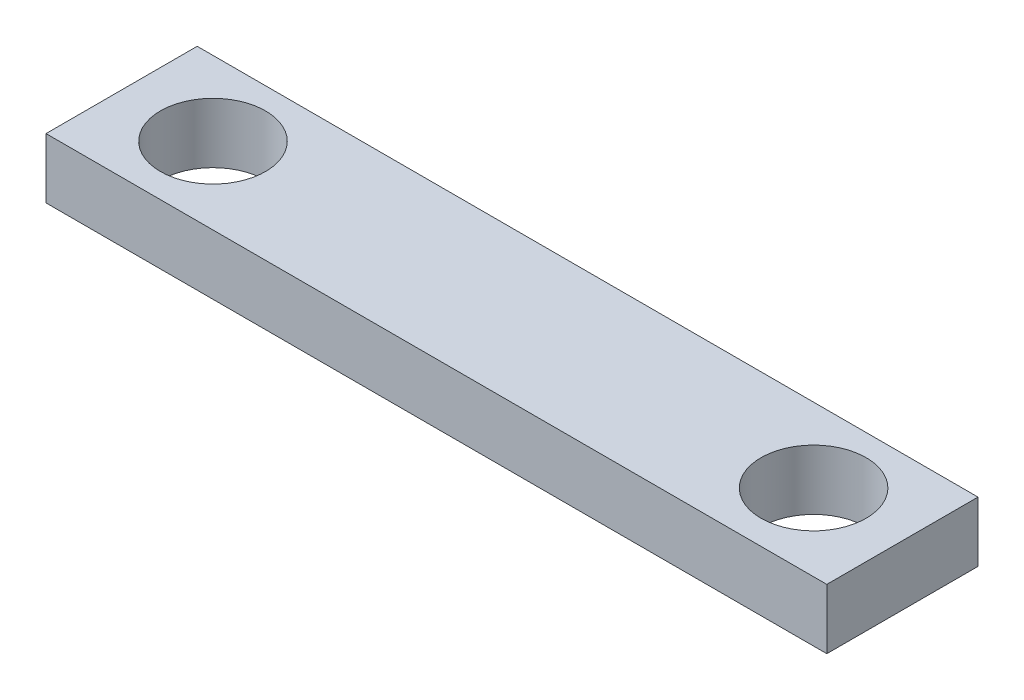
ISO-10303-21;
HEADER;
FILE_DESCRIPTION(('STEP AP214'),'2;1');
FILE_NAME('part.step','',(''),(''),'','','');
FILE_SCHEMA(('AUTOMOTIVE_DESIGN { 1 0 10303 214 1 1 1 1 }'));
ENDSEC;
DATA;
#1=APPLICATION_CONTEXT('core data for automotive mechanical design processes');
#2=APPLICATION_PROTOCOL_DEFINITION('international standard','automotive_design',2000,#1);
#3=PRODUCT_CONTEXT('',#1,'mechanical');
#4=PRODUCT('Part','Part','',(#3));
#5=PRODUCT_RELATED_PRODUCT_CATEGORY('part','',(#4));
#6=PRODUCT_DEFINITION_FORMATION('','',#4);
#7=PRODUCT_DEFINITION_CONTEXT('part definition',#1,'design');
#8=PRODUCT_DEFINITION('design','',#6,#7);
#9=PRODUCT_DEFINITION_SHAPE('','',#8);
#10=(LENGTH_UNIT() NAMED_UNIT(*) SI_UNIT(.MILLI.,.METRE.));
#11=(NAMED_UNIT(*) PLANE_ANGLE_UNIT() SI_UNIT($,.RADIAN.));
#12=(NAMED_UNIT(*) SI_UNIT($,.STERADIAN.) SOLID_ANGLE_UNIT());
#13=UNCERTAINTY_MEASURE_WITH_UNIT(LENGTH_MEASURE(1.E-05),#10,'distance_accuracy_value','');
#14=(GEOMETRIC_REPRESENTATION_CONTEXT(3) GLOBAL_UNCERTAINTY_ASSIGNED_CONTEXT((#13)) GLOBAL_UNIT_ASSIGNED_CONTEXT((#10,
#11,#12)) REPRESENTATION_CONTEXT('',''));
#15=CARTESIAN_POINT('',(0.,0.,0.));
#16=DIRECTION('',(0.,0.,1.));
#17=DIRECTION('',(1.,0.,0.));
#18=AXIS2_PLACEMENT_3D('',#15,#16,#17);
#19=CARTESIAN_POINT('',(0.,2.,0.));
#20=DIRECTION('',(0.,1.,0.));
#21=DIRECTION('',(0.,0.,1.));
#22=AXIS2_PLACEMENT_3D('',#19,#20,#21);
#23=PLANE('',#22);
#24=CARTESIAN_POINT('',(-5.61881850166234,2.,-0.384006764925553));
#25=DIRECTION('',(0.,1.,0.));
#26=DIRECTION('',(0.,0.,1.));
#27=AXIS2_PLACEMENT_3D('',#24,#25,#26);
#28=CIRCLE('',#27,1.75);
#29=CARTESIAN_POINT('',(-5.61881850166234,2.,1.36599323507445));
#30=VERTEX_POINT('',#29);
#31=EDGE_CURVE('E106',#30,#30,#28,.T.);
#32=ORIENTED_EDGE('',*,*,#31,.F.);
#33=EDGE_LOOP('',(#32));
#34=FACE_BOUND('',#33,.T.);
#35=DIRECTION('',(0.,0.,1.));
#36=VECTOR('',#35,1.);
#37=CARTESIAN_POINT('',(-8.61881850166234,2.,-2.8587170277791));
#38=LINE('',#37,#36);
#39=CARTESIAN_POINT('',(-8.61881850166234,2.,-2.8587170277791));
#40=VERTEX_POINT('',#39);
#41=CARTESIAN_POINT('',(-8.61881850166234,2.,2.17603833457811));
#42=VERTEX_POINT('',#41);
#43=EDGE_CURVE('E91',#40,#42,#38,.T.);
#44=ORIENTED_EDGE('',*,*,#43,.T.);
#45=DIRECTION('',(1.,0.,0.));
#46=VECTOR('',#45,1.);
#47=CARTESIAN_POINT('',(-8.61881850166234,2.,2.17603833457811));
#48=LINE('',#47,#46);
#49=CARTESIAN_POINT('',(17.3811814983377,2.,2.17603833457811));
#50=VERTEX_POINT('',#49);
#51=EDGE_CURVE('E86',#42,#50,#48,.T.);
#52=ORIENTED_EDGE('',*,*,#51,.T.);
#53=DIRECTION('',(0.,0.,-1.));
#54=VECTOR('',#53,1.);
#55=CARTESIAN_POINT('',(17.3811814983377,2.,-2.8587170277791));
#56=LINE('',#55,#54);
#57=CARTESIAN_POINT('',(17.3811814983377,2.,-2.8587170277791));
#58=VERTEX_POINT('',#57);
#59=EDGE_CURVE('E89',#50,#58,#56,.T.);
#60=ORIENTED_EDGE('',*,*,#59,.T.);
#61=DIRECTION('',(-1.,0.,0.));
#62=VECTOR('',#61,1.);
#63=CARTESIAN_POINT('',(-8.61881850166234,2.,-2.8587170277791));
#64=LINE('',#63,#62);
#65=EDGE_CURVE('E56',#58,#40,#64,.T.);
#66=ORIENTED_EDGE('',*,*,#65,.T.);
#67=EDGE_LOOP('',(#44,#52,#60,#66));
#68=FACE_BOUND('',#67,.T.);
#69=CARTESIAN_POINT('',(14.3811814983377,2.,-0.384006764925553));
#70=DIRECTION('',(0.,1.,0.));
#71=DIRECTION('',(0.,0.,1.));
#72=AXIS2_PLACEMENT_3D('',#69,#70,#71);
#73=CIRCLE('',#72,1.75);
#74=CARTESIAN_POINT('',(14.3811814983377,2.,1.36599323507445));
#75=VERTEX_POINT('',#74);
#76=EDGE_CURVE('E121',#75,#75,#73,.T.);
#77=ORIENTED_EDGE('',*,*,#76,.F.);
#78=EDGE_LOOP('',(#77));
#79=FACE_BOUND('',#78,.T.);
#80=ADVANCED_FACE('F39',(#34,#68,#79),#23,.T.);
#81=CARTESIAN_POINT('',(0.,0.,0.));
#82=DIRECTION('',(0.,1.,0.));
#83=DIRECTION('',(0.,0.,1.));
#84=AXIS2_PLACEMENT_3D('',#81,#82,#83);
#85=PLANE('',#84);
#86=DIRECTION('',(0.,0.,1.));
#87=VECTOR('',#86,1.);
#88=CARTESIAN_POINT('',(-8.61881850166234,0.,-2.8587170277791));
#89=LINE('',#88,#87);
#90=CARTESIAN_POINT('',(-8.61881850166234,0.,-2.8587170277791));
#91=VERTEX_POINT('',#90);
#92=CARTESIAN_POINT('',(-8.61881850166234,0.,2.17603833457811));
#93=VERTEX_POINT('',#92);
#94=EDGE_CURVE('E103',#91,#93,#89,.T.);
#95=ORIENTED_EDGE('',*,*,#94,.F.);
#96=DIRECTION('',(-1.,0.,0.));
#97=VECTOR('',#96,1.);
#98=CARTESIAN_POINT('',(-8.61881850166234,0.,-2.8587170277791));
#99=LINE('',#98,#97);
#100=CARTESIAN_POINT('',(17.3811814983377,0.,-2.8587170277791));
#101=VERTEX_POINT('',#100);
#102=EDGE_CURVE('E79',#101,#91,#99,.T.);
#103=ORIENTED_EDGE('',*,*,#102,.F.);
#104=DIRECTION('',(0.,0.,-1.));
#105=VECTOR('',#104,1.);
#106=CARTESIAN_POINT('',(17.3811814983377,0.,-2.8587170277791));
#107=LINE('',#106,#105);
#108=CARTESIAN_POINT('',(17.3811814983377,0.,2.17603833457811));
#109=VERTEX_POINT('',#108);
#110=EDGE_CURVE('E73',#109,#101,#107,.T.);
#111=ORIENTED_EDGE('',*,*,#110,.F.);
#112=DIRECTION('',(1.,0.,0.));
#113=VECTOR('',#112,1.);
#114=CARTESIAN_POINT('',(-8.61881850166234,0.,2.17603833457811));
#115=LINE('',#114,#113);
#116=EDGE_CURVE('E95',#93,#109,#115,.T.);
#117=ORIENTED_EDGE('',*,*,#116,.F.);
#118=EDGE_LOOP('',(#95,#103,#111,#117));
#119=FACE_BOUND('',#118,.T.);
#120=CARTESIAN_POINT('',(-5.61881850166234,0.,-0.384006764925553));
#121=DIRECTION('',(0.,1.,0.));
#122=DIRECTION('',(0.,0.,1.));
#123=AXIS2_PLACEMENT_3D('',#120,#121,#122);
#124=CIRCLE('',#123,1.75);
#125=CARTESIAN_POINT('',(-5.61881850166234,0.,1.36599323507445));
#126=VERTEX_POINT('',#125);
#127=EDGE_CURVE('E118',#126,#126,#124,.T.);
#128=ORIENTED_EDGE('',*,*,#127,.T.);
#129=EDGE_LOOP('',(#128));
#130=FACE_BOUND('',#129,.T.);
#131=CARTESIAN_POINT('',(14.3811814983377,0.,-0.384006764925553));
#132=DIRECTION('',(0.,1.,0.));
#133=DIRECTION('',(0.,0.,1.));
#134=AXIS2_PLACEMENT_3D('',#131,#132,#133);
#135=CIRCLE('',#134,1.75);
#136=CARTESIAN_POINT('',(14.3811814983377,0.,1.36599323507445));
#137=VERTEX_POINT('',#136);
#138=EDGE_CURVE('E124',#137,#137,#135,.T.);
#139=ORIENTED_EDGE('',*,*,#138,.T.);
#140=EDGE_LOOP('',(#139));
#141=FACE_BOUND('',#140,.T.);
#142=ADVANCED_FACE('F114',(#119,#130,#141),#85,.F.);
#143=CARTESIAN_POINT('',(-8.61881850166234,2.,-2.8587170277791));
#144=DIRECTION('',(1.,0.,0.));
#145=DIRECTION('',(0.,0.,-1.));
#146=AXIS2_PLACEMENT_3D('',#143,#144,#145);
#147=PLANE('',#146);
#148=ORIENTED_EDGE('',*,*,#94,.T.);
#149=DIRECTION('',(0.,-1.,0.));
#150=VECTOR('',#149,1.);
#151=CARTESIAN_POINT('',(-8.61881850166234,2.,2.17603833457811));
#152=LINE('',#151,#150);
#153=EDGE_CURVE('E11',#42,#93,#152,.T.);
#154=ORIENTED_EDGE('',*,*,#153,.F.);
#155=ORIENTED_EDGE('',*,*,#43,.F.);
#156=DIRECTION('',(0.,-1.,0.));
#157=VECTOR('',#156,1.);
#158=CARTESIAN_POINT('',(-8.61881850166234,2.,-2.8587170277791));
#159=LINE('',#158,#157);
#160=EDGE_CURVE('E99',#40,#91,#159,.T.);
#161=ORIENTED_EDGE('',*,*,#160,.T.);
#162=EDGE_LOOP('',(#148,#154,#155,#161));
#163=FACE_BOUND('',#162,.T.);
#164=ADVANCED_FACE('F41',(#163),#147,.F.);
#165=CARTESIAN_POINT('',(-8.61881850166234,2.,2.17603833457811));
#166=DIRECTION('',(0.,0.,-1.));
#167=DIRECTION('',(-1.,0.,0.));
#168=AXIS2_PLACEMENT_3D('',#165,#166,#167);
#169=PLANE('',#168);
#170=ORIENTED_EDGE('',*,*,#116,.T.);
#171=DIRECTION('',(0.,-1.,0.));
#172=VECTOR('',#171,1.);
#173=CARTESIAN_POINT('',(17.3811814983377,2.,2.17603833457811));
#174=LINE('',#173,#172);
#175=EDGE_CURVE('E48',#50,#109,#174,.T.);
#176=ORIENTED_EDGE('',*,*,#175,.F.);
#177=ORIENTED_EDGE('',*,*,#51,.F.);
#178=ORIENTED_EDGE('',*,*,#153,.T.);
#179=EDGE_LOOP('',(#170,#176,#177,#178));
#180=FACE_BOUND('',#179,.T.);
#181=ADVANCED_FACE('F94',(#180),#169,.F.);
#182=CARTESIAN_POINT('',(17.3811814983377,2.,-2.8587170277791));
#183=DIRECTION('',(-1.,0.,0.));
#184=DIRECTION('',(0.,0.,1.));
#185=AXIS2_PLACEMENT_3D('',#182,#183,#184);
#186=PLANE('',#185);
#187=ORIENTED_EDGE('',*,*,#110,.T.);
#188=DIRECTION('',(0.,-1.,0.));
#189=VECTOR('',#188,1.);
#190=CARTESIAN_POINT('',(17.3811814983377,2.,-2.8587170277791));
#191=LINE('',#190,#189);
#192=EDGE_CURVE('E96',#58,#101,#191,.T.);
#193=ORIENTED_EDGE('',*,*,#192,.F.);
#194=ORIENTED_EDGE('',*,*,#59,.F.);
#195=ORIENTED_EDGE('',*,*,#175,.T.);
#196=EDGE_LOOP('',(#187,#193,#194,#195));
#197=FACE_BOUND('',#196,.T.);
#198=ADVANCED_FACE('F97',(#197),#186,.F.);
#199=CARTESIAN_POINT('',(-8.61881850166234,2.,-2.8587170277791));
#200=DIRECTION('',(0.,0.,1.));
#201=DIRECTION('',(1.,0.,0.));
#202=AXIS2_PLACEMENT_3D('',#199,#200,#201);
#203=PLANE('',#202);
#204=ORIENTED_EDGE('',*,*,#102,.T.);
#205=ORIENTED_EDGE('',*,*,#160,.F.);
#206=ORIENTED_EDGE('',*,*,#65,.F.);
#207=ORIENTED_EDGE('',*,*,#192,.T.);
#208=EDGE_LOOP('',(#204,#205,#206,#207));
#209=FACE_BOUND('',#208,.T.);
#210=ADVANCED_FACE('F111',(#209),#203,.F.);
#211=CARTESIAN_POINT('',(-5.61881850166234,2.,-0.384006764925553));
#212=DIRECTION('',(0.,-1.,0.));
#213=DIRECTION('',(0.,0.,-1.));
#214=AXIS2_PLACEMENT_3D('',#211,#212,#213);
#215=CYLINDRICAL_SURFACE('',#214,1.75);
#216=ORIENTED_EDGE('',*,*,#31,.T.);
#217=EDGE_LOOP('',(#216));
#218=FACE_BOUND('',#217,.T.);
#219=ORIENTED_EDGE('',*,*,#127,.F.);
#220=EDGE_LOOP('',(#219));
#221=FACE_BOUND('',#220,.T.);
#222=ADVANCED_FACE('F141',(#218,#221),#215,.F.);
#223=CARTESIAN_POINT('',(14.3811814983377,2.,-0.384006764925553));
#224=DIRECTION('',(0.,-1.,0.));
#225=DIRECTION('',(0.,0.,-1.));
#226=AXIS2_PLACEMENT_3D('',#223,#224,#225);
#227=CYLINDRICAL_SURFACE('',#226,1.75);
#228=ORIENTED_EDGE('',*,*,#76,.T.);
#229=EDGE_LOOP('',(#228));
#230=FACE_BOUND('',#229,.T.);
#231=ORIENTED_EDGE('',*,*,#138,.F.);
#232=EDGE_LOOP('',(#231));
#233=FACE_BOUND('',#232,.T.);
#234=ADVANCED_FACE('F130',(#230,#233),#227,.F.);
#235=CLOSED_SHELL('',(#80,#142,#164,#181,#198,#210,#222,#234));
#236=MANIFOLD_SOLID_BREP('B2',#235);
#237=ADVANCED_BREP_SHAPE_REPRESENTATION('',(#18,#236),#14);
#238=SHAPE_DEFINITION_REPRESENTATION(#9,#237);
ENDSEC;
END-ISO-10303-21;
